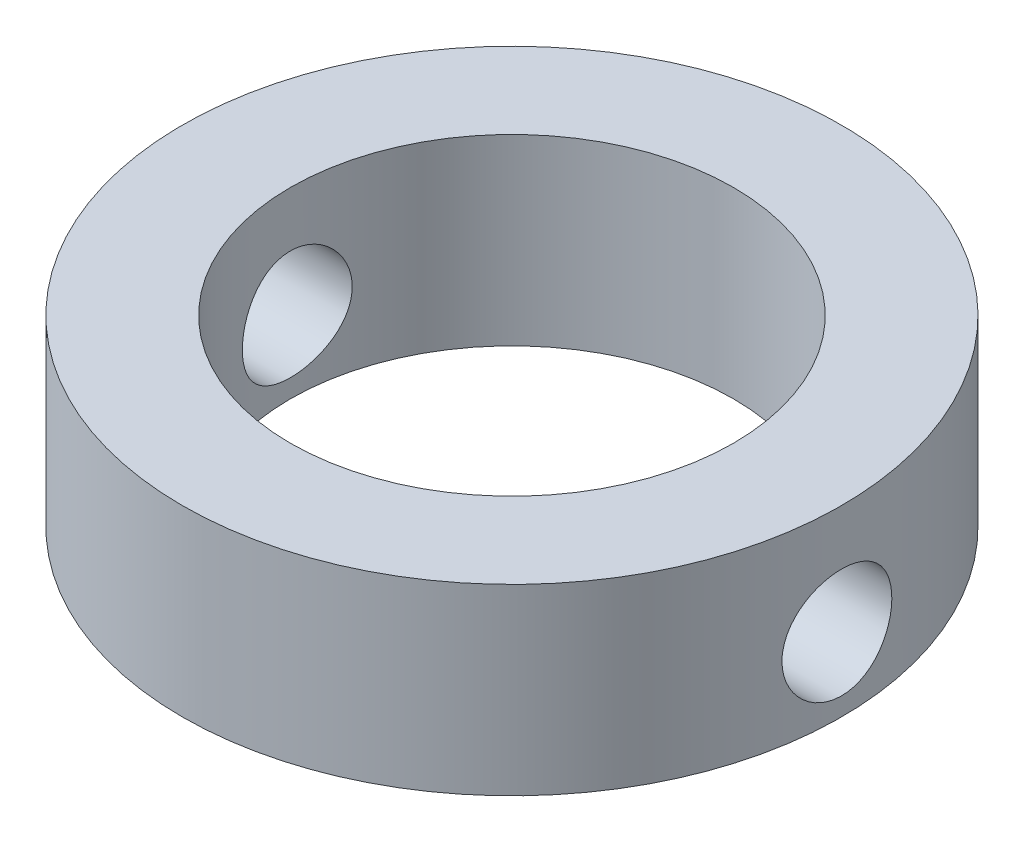
ISO-10303-21;
HEADER;
FILE_DESCRIPTION(('STEP AP214'),'2;1');
FILE_NAME('part.step','',(''),(''),'','','');
FILE_SCHEMA(('AUTOMOTIVE_DESIGN { 1 0 10303 214 1 1 1 1 }'));
ENDSEC;
DATA;
#1=APPLICATION_CONTEXT('core data for automotive mechanical design processes');
#2=APPLICATION_PROTOCOL_DEFINITION('international standard','automotive_design',2000,#1);
#3=PRODUCT_CONTEXT('',#1,'mechanical');
#4=PRODUCT('Part','Part','',(#3));
#5=PRODUCT_RELATED_PRODUCT_CATEGORY('part','',(#4));
#6=PRODUCT_DEFINITION_FORMATION('','',#4);
#7=PRODUCT_DEFINITION_CONTEXT('part definition',#1,'design');
#8=PRODUCT_DEFINITION('design','',#6,#7);
#9=PRODUCT_DEFINITION_SHAPE('','',#8);
#10=(LENGTH_UNIT() NAMED_UNIT(*) SI_UNIT(.MILLI.,.METRE.));
#11=(NAMED_UNIT(*) PLANE_ANGLE_UNIT() SI_UNIT($,.RADIAN.));
#12=(NAMED_UNIT(*) SI_UNIT($,.STERADIAN.) SOLID_ANGLE_UNIT());
#13=UNCERTAINTY_MEASURE_WITH_UNIT(LENGTH_MEASURE(1.E-05),#10,'distance_accuracy_value','');
#14=(GEOMETRIC_REPRESENTATION_CONTEXT(3) GLOBAL_UNCERTAINTY_ASSIGNED_CONTEXT((#13)) GLOBAL_UNIT_ASSIGNED_CONTEXT((#10,
#11,#12)) REPRESENTATION_CONTEXT('',''));
#15=CARTESIAN_POINT('',(0.,0.,0.));
#16=DIRECTION('',(0.,0.,1.));
#17=DIRECTION('',(1.,0.,0.));
#18=AXIS2_PLACEMENT_3D('',#15,#16,#17);
#19=CARTESIAN_POINT('',(-19.0091828831705,-210.,-53.2448828787845));
#20=DIRECTION('',(0.,-1.,0.));
#21=DIRECTION('',(0.,0.,-1.));
#22=AXIS2_PLACEMENT_3D('',#19,#20,#21);
#23=CYLINDRICAL_SURFACE('',#22,9.);
#24=CARTESIAN_POINT('',(-19.0091828831705,-210.,-53.2448828787845));
#25=DIRECTION('',(0.,1.,0.));
#26=DIRECTION('',(0.,0.,1.));
#27=AXIS2_PLACEMENT_3D('',#24,#25,#26);
#28=CIRCLE('',#27,9.);
#29=CARTESIAN_POINT('',(-19.0091828831705,-210.,-44.2448828787845));
#30=VERTEX_POINT('',#29);
#31=EDGE_CURVE('E10',#30,#30,#28,.T.);
#32=ORIENTED_EDGE('',*,*,#31,.F.);
#33=EDGE_LOOP('',(#32));
#34=FACE_BOUND('',#33,.T.);
#35=CARTESIAN_POINT('',(-19.0091828831705,-215.,-53.2448828787845));
#36=DIRECTION('',(0.,1.,0.));
#37=DIRECTION('',(0.,0.,1.));
#38=AXIS2_PLACEMENT_3D('',#35,#36,#37);
#39=CIRCLE('',#38,9.);
#40=CARTESIAN_POINT('',(-19.0091828831705,-215.,-44.2448828787845));
#41=VERTEX_POINT('',#40);
#42=EDGE_CURVE('E55',#41,#41,#39,.T.);
#43=ORIENTED_EDGE('',*,*,#42,.T.);
#44=EDGE_LOOP('',(#43));
#45=FACE_BOUND('',#44,.T.);
#46=CARTESIAN_POINT('',(-27.88330255782,-213.,-51.7448828787845));
#47=CARTESIAN_POINT('',(-27.8833040675782,-212.916374551112,-51.7448862397319));
#48=CARTESIAN_POINT('',(-27.8844974384589,-212.832703436385,-51.7518997773621));
#49=CARTESIAN_POINT('',(-27.8891376273796,-212.667708874068,-51.7797564219392));
#50=CARTESIAN_POINT('',(-27.8925865235191,-212.58638766375,-51.8006122825987));
#51=CARTESIAN_POINT('',(-27.9013365391045,-212.428504629986,-51.8555051525842));
#52=CARTESIAN_POINT('',(-27.9066361102022,-212.3519388908,-51.8895311458258));
#53=CARTESIAN_POINT('',(-27.9184885158566,-212.205611427172,-51.9697709806502));
#54=CARTESIAN_POINT('',(-27.9250412093554,-212.135848938254,-52.0159834506835));
#55=CARTESIAN_POINT('',(-27.9387337100862,-212.004412290153,-52.1197703626047));
#56=CARTESIAN_POINT('',(-27.9458781871329,-211.942814921168,-52.1774414494251));
#57=CARTESIAN_POINT('',(-27.9599077671873,-211.830124015883,-52.3022996759673));
#58=CARTESIAN_POINT('',(-27.9667928548024,-211.779031102131,-52.3694873792945));
#59=CARTESIAN_POINT('',(-27.9795773050654,-211.688511259668,-52.5119691568155));
#60=CARTESIAN_POINT('',(-27.9854705377642,-211.649155795361,-52.5873092299105));
#61=CARTESIAN_POINT('',(-27.9955553049135,-211.583687357682,-52.7436455057502));
#62=CARTESIAN_POINT('',(-27.9997469500066,-211.557573523269,-52.8246413403376));
#63=CARTESIAN_POINT('',(-28.0059232915168,-211.51956447901,-52.9891966429779));
#64=CARTESIAN_POINT('',(-28.007928001836,-211.507540250397,-53.0727255467769));
#65=CARTESIAN_POINT('',(-28.0095733592272,-211.497650547508,-53.240637707469));
#66=CARTESIAN_POINT('',(-28.0092141669864,-211.499784110852,-53.3250209059018));
#67=CARTESIAN_POINT('',(-28.0061880337589,-211.518048810917,-53.4913641898318));
#68=CARTESIAN_POINT('',(-28.0035439853249,-211.534041098045,-53.5733399972046));
#69=CARTESIAN_POINT('',(-27.9962707558004,-211.579350644548,-53.7334280665515));
#70=CARTESIAN_POINT('',(-27.9916415142498,-211.608668309754,-53.8115402107754));
#71=CARTESIAN_POINT('',(-27.9808790742423,-211.679934384189,-53.962096567454));
#72=CARTESIAN_POINT('',(-27.9747390871318,-211.721940007249,-54.0345131925959));
#73=CARTESIAN_POINT('',(-27.9616373115995,-211.817347693581,-54.1713221966924));
#74=CARTESIAN_POINT('',(-27.9546754566853,-211.870750679226,-54.235713925534));
#75=CARTESIAN_POINT('',(-27.9406044925661,-211.988207283972,-54.3554656428525));
#76=CARTESIAN_POINT('',(-27.9334946215568,-212.052382256941,-54.4107065801364));
#77=CARTESIAN_POINT('',(-27.9200106418794,-212.189152254129,-54.5096556318533));
#78=CARTESIAN_POINT('',(-27.9136365399985,-212.26174735601,-54.5533636399039));
#79=CARTESIAN_POINT('',(-27.9023454105414,-212.413434985126,-54.6280295394775));
#80=CARTESIAN_POINT('',(-27.8974300229861,-212.492534698855,-54.658973095152));
#81=CARTESIAN_POINT('',(-27.8896400153098,-212.654909443385,-54.7071008012738));
#82=CARTESIAN_POINT('',(-27.8867652155005,-212.738184105859,-54.7242861632452));
#83=CARTESIAN_POINT('',(-27.8834166397032,-212.905479693697,-54.744242009712));
#84=CARTESIAN_POINT('',(-27.8829145977225,-212.989479827821,-54.7471822035319));
#85=CARTESIAN_POINT('',(-27.8842930918647,-213.156772003015,-54.739016500394));
#86=CARTESIAN_POINT('',(-27.8861735359617,-213.240064071308,-54.7279111459593));
#87=CARTESIAN_POINT('',(-27.8920790079006,-213.403036655514,-54.6921142797413));
#88=CARTESIAN_POINT('',(-27.8960903946806,-213.482736683927,-54.6675091531723));
#89=CARTESIAN_POINT('',(-27.9057943212035,-213.636882099768,-54.6055017928998));
#90=CARTESIAN_POINT('',(-27.911486961514,-213.711327172531,-54.568098793645));
#91=CARTESIAN_POINT('',(-27.9239776535549,-213.853604756644,-54.481156882722));
#92=CARTESIAN_POINT('',(-27.9307854167726,-213.921369943654,-54.4315092172801));
#93=CARTESIAN_POINT('',(-27.9447108832497,-214.047668119617,-54.3216365582093));
#94=CARTESIAN_POINT('',(-27.9518286082825,-214.106200458666,-54.2614108206149));
#95=CARTESIAN_POINT('',(-27.9656614158801,-214.212991135637,-54.1313397209818));
#96=CARTESIAN_POINT('',(-27.9723715412386,-214.261136295771,-54.0614008308162));
#97=CARTESIAN_POINT('',(-27.9845535577682,-214.344993196203,-53.9143289475541));
#98=CARTESIAN_POINT('',(-27.9900254889904,-214.380705338684,-53.8371961872669));
#99=CARTESIAN_POINT('',(-27.999093032188,-214.438506350373,-53.6782623096853));
#100=CARTESIAN_POINT('',(-28.0026967905763,-214.460654445441,-53.5964832163461));
#101=CARTESIAN_POINT('',(-28.0076563821862,-214.490889359378,-53.430301319709));
#102=CARTESIAN_POINT('',(-28.0090124003716,-214.498977335239,-53.3458987328775));
#103=CARTESIAN_POINT('',(-28.0093211104975,-214.500829129387,-53.1779581133203));
#104=CARTESIAN_POINT('',(-28.008302695316,-214.494765152365,-53.0944219824229));
#105=CARTESIAN_POINT('',(-28.0040359534942,-214.468857646638,-52.9295756941957));
#106=CARTESIAN_POINT('',(-28.0007876393405,-214.449014195094,-52.848265524404));
#107=CARTESIAN_POINT('',(-27.992424816136,-214.396177100674,-52.6902450112333));
#108=CARTESIAN_POINT('',(-27.9873123854199,-214.363198099074,-52.6135296554921));
#109=CARTESIAN_POINT('',(-27.9757794244346,-214.285045238262,-52.4666946069953));
#110=CARTESIAN_POINT('',(-27.9693588321598,-214.239870800963,-52.396575227114));
#111=CARTESIAN_POINT('',(-27.9558286608844,-214.137998944523,-52.2640551114682));
#112=CARTESIAN_POINT('',(-27.9487120304749,-214.081175427146,-52.2017520204211));
#113=CARTESIAN_POINT('',(-27.934640702999,-213.957883015261,-52.0875045532157));
#114=CARTESIAN_POINT('',(-27.9276860442522,-213.891411864665,-52.0355626067638));
#115=CARTESIAN_POINT('',(-27.9146729445911,-213.750152806495,-51.9431743162327));
#116=CARTESIAN_POINT('',(-27.9086211910579,-213.675309396097,-51.9028118853277));
#117=CARTESIAN_POINT('',(-27.8981781445011,-213.519834458453,-51.8352941569199));
#118=CARTESIAN_POINT('',(-27.8937851936782,-213.439208806382,-51.8081256656455));
#119=CARTESIAN_POINT('',(-27.8881313521972,-213.298557738314,-51.7736672469112));
#120=CARTESIAN_POINT('',(-27.8863306236966,-213.239383915225,-51.7628904281823));
#121=CARTESIAN_POINT('',(-27.8839156948897,-213.120147909095,-51.748497101675));
#122=CARTESIAN_POINT('',(-27.8833014730432,-213.060085742202,-51.7448804639093));
#123=CARTESIAN_POINT('',(-27.88330255782,-213.,-51.7448828787845));
#124=B_SPLINE_CURVE_WITH_KNOTS('',3,(#46,#47,#48,#49,#50,#51,#52,#53,#54,#55,#56,#57,#58,#59,
#60,#61,#62,#63,#64,#65,#66,#67,#68,#69,#70,#71,#72,#73,#74,#75,#76,#77,#78,#79,#80,#81,#82,#83,
#84,#85,#86,#87,#88,#89,#90,#91,#92,#93,#94,#95,#96,#97,#98,#99,#100,#101,#102,#103,#104,#105,
#106,#107,#108,#109,#110,#111,#112,#113,#114,#115,#116,#117,#118,#119,#120,#121,#122,#123),
.UNSPECIFIED.,.T.,.F.,(4,2,2,2,2,2,2,2,2,2,2,2,2,2,2,2,2,2,2,2,2,2,2,2,2,2,2,2,2,2,2,2,2,2,2,2,
2,2,4),(0.,0.250656623343164,0.501544511951658,0.752222998698981,1.00287328440552,
1.25573495490816,1.50861160698055,1.76299788064249,2.01736761064056,2.26938940480927,
2.52139406789003,2.7709027269619,3.02041898547107,3.2710776248104,3.52175655733445,
3.77547674074661,4.02919926445001,4.28320597496551,4.53719031560234,4.78814125449636,
5.03908250045774,5.28843638778683,5.53780519373534,5.78947405655008,6.04116062655803,
6.29546467818616,6.54976050283404,6.80293790647973,7.05609447544798,7.30618665756937,
7.55627743928683,7.80609023896861,8.05591488232788,8.30860198475339,8.56134827326476,
8.81588236567713,9.07016140042578,9.25026402322166,9.43036337636995),.UNSPECIFIED.);
#125=CARTESIAN_POINT('',(-27.88330255782,-213.,-51.7448828787845));
#126=VERTEX_POINT('',#125);
#127=EDGE_CURVE('E85',#126,#126,#124,.T.);
#128=ORIENTED_EDGE('',*,*,#127,.F.);
#129=EDGE_LOOP('',(#128));
#130=FACE_BOUND('',#129,.T.);
#131=CARTESIAN_POINT('',(-10.1350632085211,-213.,-51.7448828787845));
#132=CARTESIAN_POINT('',(-10.1350616987629,-213.083625448888,-51.7448862397319));
#133=CARTESIAN_POINT('',(-10.1338683278821,-213.167296563615,-51.7518997773621));
#134=CARTESIAN_POINT('',(-10.1292281389615,-213.332291125932,-51.7797564219392));
#135=CARTESIAN_POINT('',(-10.125779242822,-213.41361233625,-51.8006122825987));
#136=CARTESIAN_POINT('',(-10.1170292272366,-213.571495370014,-51.8555051525842));
#137=CARTESIAN_POINT('',(-10.1117296561388,-213.6480611092,-51.8895311458258));
#138=CARTESIAN_POINT('',(-10.0998772504845,-213.794388572828,-51.9697709806502));
#139=CARTESIAN_POINT('',(-10.0933245569857,-213.864151061746,-52.0159834506835));
#140=CARTESIAN_POINT('',(-10.0796320562549,-213.995587709847,-52.1197703626047));
#141=CARTESIAN_POINT('',(-10.0724875792081,-214.057185078832,-52.1774414494251));
#142=CARTESIAN_POINT('',(-10.0584579991538,-214.169875984117,-52.3022996759673));
#143=CARTESIAN_POINT('',(-10.0515729115387,-214.220968897869,-52.3694873792945));
#144=CARTESIAN_POINT('',(-10.0387884612757,-214.311488740332,-52.5119691568155));
#145=CARTESIAN_POINT('',(-10.0328952285769,-214.350844204639,-52.5873092299105));
#146=CARTESIAN_POINT('',(-10.0228104614276,-214.416312642318,-52.7436455057502));
#147=CARTESIAN_POINT('',(-10.0186188163345,-214.442426476731,-52.8246413403376));
#148=CARTESIAN_POINT('',(-10.0124424748243,-214.48043552099,-52.9891966429779));
#149=CARTESIAN_POINT('',(-10.0104377645051,-214.492459749603,-53.0727255467769));
#150=CARTESIAN_POINT('',(-10.0087924071138,-214.502349452492,-53.240637707469));
#151=CARTESIAN_POINT('',(-10.0091515993547,-214.500215889148,-53.3250209059018));
#152=CARTESIAN_POINT('',(-10.0121777325822,-214.481951189083,-53.4913641898318));
#153=CARTESIAN_POINT('',(-10.0148217810161,-214.465958901955,-53.5733399972046));
#154=CARTESIAN_POINT('',(-10.0220950105407,-214.420649355452,-53.7334280665515));
#155=CARTESIAN_POINT('',(-10.0267242520913,-214.391331690246,-53.8115402107754));
#156=CARTESIAN_POINT('',(-10.0374866920988,-214.320065615811,-53.962096567454));
#157=CARTESIAN_POINT('',(-10.0436266792093,-214.278059992751,-54.0345131925959));
#158=CARTESIAN_POINT('',(-10.0567284547415,-214.182652306419,-54.1713221966924));
#159=CARTESIAN_POINT('',(-10.0636903096557,-214.129249320774,-54.235713925534));
#160=CARTESIAN_POINT('',(-10.077761273775,-214.011792716028,-54.3554656428525));
#161=CARTESIAN_POINT('',(-10.0848711447843,-213.947617743059,-54.4107065801364));
#162=CARTESIAN_POINT('',(-10.0983551244617,-213.81084774587,-54.5096556318533));
#163=CARTESIAN_POINT('',(-10.1047292263426,-213.73825264399,-54.5533636399039));
#164=CARTESIAN_POINT('',(-10.1160203557996,-213.586565014873,-54.6280295394775));
#165=CARTESIAN_POINT('',(-10.1209357433549,-213.507465301145,-54.658973095152));
#166=CARTESIAN_POINT('',(-10.1287257510313,-213.345090556615,-54.7071008012738));
#167=CARTESIAN_POINT('',(-10.1316005508406,-213.261815894141,-54.7242861632452));
#168=CARTESIAN_POINT('',(-10.1349491266378,-213.094520306303,-54.744242009712));
#169=CARTESIAN_POINT('',(-10.1354511686185,-213.010520172179,-54.7471822035319));
#170=CARTESIAN_POINT('',(-10.1340726744764,-212.843227996986,-54.739016500394));
#171=CARTESIAN_POINT('',(-10.1321922303794,-212.759935928692,-54.7279111459593));
#172=CARTESIAN_POINT('',(-10.1262867584404,-212.596963344485,-54.6921142797413));
#173=CARTESIAN_POINT('',(-10.1222753716604,-212.517263316073,-54.6675091531723));
#174=CARTESIAN_POINT('',(-10.1125714451375,-212.363117900232,-54.6055017928998));
#175=CARTESIAN_POINT('',(-10.1068788048271,-212.288672827469,-54.568098793645));
#176=CARTESIAN_POINT('',(-10.0943881127862,-212.146395243356,-54.481156882722));
#177=CARTESIAN_POINT('',(-10.0875803495684,-212.078630056346,-54.4315092172801));
#178=CARTESIAN_POINT('',(-10.0736548830913,-211.952331880383,-54.3216365582093));
#179=CARTESIAN_POINT('',(-10.0665371580585,-211.893799541334,-54.2614108206149));
#180=CARTESIAN_POINT('',(-10.0527043504609,-211.787008864363,-54.1313397209818));
#181=CARTESIAN_POINT('',(-10.0459942251025,-211.738863704229,-54.0614008308162));
#182=CARTESIAN_POINT('',(-10.0338122085729,-211.655006803797,-53.9143289475541));
#183=CARTESIAN_POINT('',(-10.0283402773507,-211.619294661316,-53.8371961872668));
#184=CARTESIAN_POINT('',(-10.019272734153,-211.561493649627,-53.6782623096853));
#185=CARTESIAN_POINT('',(-10.0156689757648,-211.539345554559,-53.596483216346));
#186=CARTESIAN_POINT('',(-10.0107093841548,-211.509110640622,-53.430301319709));
#187=CARTESIAN_POINT('',(-10.0093533659695,-211.501022664761,-53.3458987328775));
#188=CARTESIAN_POINT('',(-10.0090446558436,-211.499170870613,-53.1779581133203));
#189=CARTESIAN_POINT('',(-10.0100630710251,-211.505234847635,-53.0944219824229));
#190=CARTESIAN_POINT('',(-10.0143298128468,-211.531142353362,-52.9295756941957));
#191=CARTESIAN_POINT('',(-10.0175781270005,-211.550985804906,-52.848265524404));
#192=CARTESIAN_POINT('',(-10.025940950205,-211.603822899326,-52.6902450112333));
#193=CARTESIAN_POINT('',(-10.0310533809212,-211.636801900926,-52.6135296554921));
#194=CARTESIAN_POINT('',(-10.0425863419064,-211.714954761738,-52.4666946069953));
#195=CARTESIAN_POINT('',(-10.0490069341812,-211.760129199037,-52.396575227114));
#196=CARTESIAN_POINT('',(-10.0625371054567,-211.862001055477,-52.2640551114682));
#197=CARTESIAN_POINT('',(-10.0696537358661,-211.918824572854,-52.2017520204211));
#198=CARTESIAN_POINT('',(-10.083725063342,-212.042116984739,-52.0875045532157));
#199=CARTESIAN_POINT('',(-10.0906797220889,-212.108588135335,-52.0355626067638));
#200=CARTESIAN_POINT('',(-10.1036928217499,-212.249847193505,-51.9431743162327));
#201=CARTESIAN_POINT('',(-10.1097445752831,-212.324690603903,-51.9028118853277));
#202=CARTESIAN_POINT('',(-10.1201876218399,-212.480165541547,-51.8352941569199));
#203=CARTESIAN_POINT('',(-10.1245805726629,-212.560791193618,-51.8081256656455));
#204=CARTESIAN_POINT('',(-10.1302344141439,-212.701442261686,-51.7736672469112));
#205=CARTESIAN_POINT('',(-10.1320351426444,-212.760616084775,-51.7628904281823));
#206=CARTESIAN_POINT('',(-10.1344500714514,-212.879852090905,-51.748497101675));
#207=CARTESIAN_POINT('',(-10.1350642932979,-212.939914257798,-51.7448804639093));
#208=CARTESIAN_POINT('',(-10.1350632085211,-213.,-51.7448828787845));
#209=B_SPLINE_CURVE_WITH_KNOTS('',3,(#131,#132,#133,#134,#135,#136,#137,#138,#139,#140,#141,
#142,#143,#144,#145,#146,#147,#148,#149,#150,#151,#152,#153,#154,#155,#156,#157,#158,#159,#160,
#161,#162,#163,#164,#165,#166,#167,#168,#169,#170,#171,#172,#173,#174,#175,#176,#177,#178,#179,
#180,#181,#182,#183,#184,#185,#186,#187,#188,#189,#190,#191,#192,#193,#194,#195,#196,#197,#198,
#199,#200,#201,#202,#203,#204,#205,#206,#207,#208),.UNSPECIFIED.,.T.,.F.,(4,2,2,2,2,2,2,2,2,2,2,
2,2,2,2,2,2,2,2,2,2,2,2,2,2,2,2,2,2,2,2,2,2,2,2,2,2,2,4),(0.,0.250656623343164,
0.501544511951658,0.752222998698981,1.00287328440552,1.25573495490816,1.50861160698055,
1.76299788064249,2.01736761064056,2.26938940480927,2.52139406789003,2.77090272696189,
3.02041898547107,3.2710776248104,3.52175655733445,3.77547674074661,4.02919926445001,
4.28320597496551,4.53719031560234,4.78814125449633,5.03908250045774,5.28843638778683,
5.53780519373534,5.78947405655009,6.04116062655803,6.29546467818618,6.54976050283409,
6.80293790647977,7.05609447544798,7.30618665756938,7.55627743928682,7.80609023896861,
8.05591488232788,8.30860198475339,8.56134827326476,8.81588236567716,9.07016140042578,
9.25026402322163,9.43036337636995),.UNSPECIFIED.);
#210=CARTESIAN_POINT('',(-10.1350632085211,-213.,-51.7448828787845));
#211=VERTEX_POINT('',#210);
#212=EDGE_CURVE('E63',#211,#211,#209,.T.);
#213=ORIENTED_EDGE('',*,*,#212,.F.);
#214=EDGE_LOOP('',(#213));
#215=FACE_BOUND('',#214,.T.);
#216=ADVANCED_FACE('F39',(#34,#45,#130,#215),#23,.T.);
#217=CARTESIAN_POINT('',(-19.0091828831705,-209.9,-53.2448828787845));
#218=DIRECTION('',(0.,-1.,0.));
#219=DIRECTION('',(0.,0.,-1.));
#220=AXIS2_PLACEMENT_3D('',#217,#218,#219);
#221=CYLINDRICAL_SURFACE('',#220,6.05);
#222=CARTESIAN_POINT('',(-24.8702834624133,-213.,-51.7448828787845));
#223=CARTESIAN_POINT('',(-24.8702850568459,-212.917145871372,-51.7448852714866));
#224=CARTESIAN_POINT('',(-24.8720595174571,-212.83426511614,-51.7517710666074));
#225=CARTESIAN_POINT('',(-24.8789478656689,-212.670882052661,-51.7790893724568));
#226=CARTESIAN_POINT('',(-24.8840637292599,-212.590381181258,-51.7995298990955));
#227=CARTESIAN_POINT('',(-24.8970206697318,-212.434144766549,-51.8532567636231));
#228=CARTESIAN_POINT('',(-24.9048582645577,-212.358403279826,-51.886526694153));
#229=CARTESIAN_POINT('',(-24.9223712447743,-212.213569094319,-51.9649181769439));
#230=CARTESIAN_POINT('',(-24.9320467002792,-212.144476649346,-52.0100401813859));
#231=CARTESIAN_POINT('',(-24.9523796561404,-212.013406159432,-52.1118981320343));
#232=CARTESIAN_POINT('',(-24.9630526354277,-211.951593249911,-52.168843525269));
#233=CARTESIAN_POINT('',(-24.9840437016995,-211.838290682976,-52.2922805759095));
#234=CARTESIAN_POINT('',(-24.9943617558478,-211.786801978596,-52.3587731136471));
#235=CARTESIAN_POINT('',(-25.0136514801466,-211.694935328621,-52.500546607136));
#236=CARTESIAN_POINT('',(-25.0226027540224,-211.654719373618,-52.5759355450226));
#237=CARTESIAN_POINT('',(-25.0379738821197,-211.587592712703,-52.7326624126282));
#238=CARTESIAN_POINT('',(-25.0443941034728,-211.560680076987,-52.8139994775348));
#239=CARTESIAN_POINT('',(-25.0538703190283,-211.521452276688,-52.978592482665));
#240=CARTESIAN_POINT('',(-25.0569908413507,-211.508856747212,-53.0617778237047));
#241=CARTESIAN_POINT('',(-25.0597408348001,-211.497740893098,-53.2291354417412));
#242=CARTESIAN_POINT('',(-25.0593708139073,-211.499218520387,-53.3133075733494));
#243=CARTESIAN_POINT('',(-25.0552295363811,-211.516004889703,-53.478305767371));
#244=CARTESIAN_POINT('',(-25.0515326948305,-211.531011035916,-53.5591647633216));
#245=CARTESIAN_POINT('',(-25.0412396704779,-211.573942381363,-53.7171792065156));
#246=CARTESIAN_POINT('',(-25.0346433347749,-211.601868261907,-53.7943344582088));
#247=CARTESIAN_POINT('',(-25.0191782452565,-211.670092763352,-53.9435514464938));
#248=CARTESIAN_POINT('',(-25.0102897408778,-211.710499557116,-54.015561593629));
#249=CARTESIAN_POINT('',(-24.9912052260717,-211.802456929857,-54.1518854701365));
#250=CARTESIAN_POINT('',(-24.9810089916444,-211.854009419009,-54.2161978773138));
#251=CARTESIAN_POINT('',(-24.9601004734071,-211.968418739372,-54.3371050379952));
#252=CARTESIAN_POINT('',(-24.9493816778842,-212.031540031227,-54.3934486825601));
#253=CARTESIAN_POINT('',(-24.9288849641037,-212.166447544473,-54.4948064376446));
#254=CARTESIAN_POINT('',(-24.9191070883614,-212.238234157074,-54.5398200363668));
#255=CARTESIAN_POINT('',(-24.9015763700652,-212.388921008808,-54.6173971643501));
#256=CARTESIAN_POINT('',(-24.8938332649706,-212.467853107807,-54.6499011607648));
#257=CARTESIAN_POINT('',(-24.8813742843728,-212.630299513716,-54.7011005722889));
#258=CARTESIAN_POINT('',(-24.8766577731665,-212.713812854385,-54.7197988872556));
#259=CARTESIAN_POINT('',(-24.8709191734455,-212.88072474514,-54.7424414489509));
#260=CARTESIAN_POINT('',(-24.8698042388138,-212.964069849902,-54.7467565794362));
#261=CARTESIAN_POINT('',(-24.8711424584858,-213.130289310283,-54.7415248691219));
#262=CARTESIAN_POINT('',(-24.8735952903387,-213.213163707763,-54.7319792810398));
#263=CARTESIAN_POINT('',(-24.8817037901151,-213.374718130252,-54.6996220670496));
#264=CARTESIAN_POINT('',(-24.8873074853785,-213.453444096,-54.6770255523593));
#265=CARTESIAN_POINT('',(-24.9010371444395,-213.605990866611,-54.6194460252897));
#266=CARTESIAN_POINT('',(-24.9091634032059,-213.679811096609,-54.5844615642934));
#267=CARTESIAN_POINT('',(-24.9272186395328,-213.822024713169,-54.5023201124649));
#268=CARTESIAN_POINT('',(-24.9371794257557,-213.89028562448,-54.4549409096159));
#269=CARTESIAN_POINT('',(-24.9577029518504,-214.018024313333,-54.3496365426515));
#270=CARTESIAN_POINT('',(-24.9682657887546,-214.077500669491,-54.2917096752495));
#271=CARTESIAN_POINT('',(-24.989117316607,-214.187479914155,-54.1652538364561));
#272=CARTESIAN_POINT('',(-24.9993928998793,-214.237726490308,-54.0964993870566));
#273=CARTESIAN_POINT('',(-25.0182432675438,-214.325960338467,-53.9513131747291));
#274=CARTESIAN_POINT('',(-25.0268181402405,-214.363948247033,-53.8748818107134));
#275=CARTESIAN_POINT('',(-25.0412471368977,-214.426259322716,-53.7170373492165));
#276=CARTESIAN_POINT('',(-25.0471206544415,-214.450680162875,-53.6356646657471));
#277=CARTESIAN_POINT('',(-25.055569989341,-214.485458073156,-53.469805777597));
#278=CARTESIAN_POINT('',(-25.0581464319434,-214.495817809803,-53.385320166369));
#279=CARTESIAN_POINT('',(-25.0596862845965,-214.502031514408,-53.2180432793975));
#280=CARTESIAN_POINT('',(-25.0587439852062,-214.498264033302,-53.1352667185128));
#281=CARTESIAN_POINT('',(-25.0535608306931,-214.477195886485,-52.9715652774665));
#282=CARTESIAN_POINT('',(-25.0493200707326,-214.459895611202,-52.890640343954));
#283=CARTESIAN_POINT('',(-25.0380305583394,-214.412454589756,-52.7333283883995));
#284=CARTESIAN_POINT('',(-25.0309965652214,-214.382381278526,-52.6569199016117));
#285=CARTESIAN_POINT('',(-25.0148619656469,-214.310309234355,-52.5101902687428));
#286=CARTESIAN_POINT('',(-25.0057611024955,-214.268309019989,-52.4398698802725));
#287=CARTESIAN_POINT('',(-24.9862062239836,-214.172415313698,-52.3055139125641));
#288=CARTESIAN_POINT('',(-24.9757253218841,-214.118264305729,-52.2416660406226));
#289=CARTESIAN_POINT('',(-24.9547141160229,-214.000107510859,-52.1238349388713));
#290=CARTESIAN_POINT('',(-24.9441838004572,-213.936099239464,-52.0698542035653));
#291=CARTESIAN_POINT('',(-24.9240473496045,-213.798637306859,-51.9723226509854));
#292=CARTESIAN_POINT('',(-24.9144616117148,-213.725032456485,-51.9289803847085));
#293=CARTESIAN_POINT('',(-24.8975727325172,-213.571354258327,-51.855349825805));
#294=CARTESIAN_POINT('',(-24.8902679119987,-213.491285724021,-51.8250519236661));
#295=CARTESIAN_POINT('',(-24.879924526445,-213.34278419005,-51.7829446986912));
#296=CARTESIAN_POINT('',(-24.876336100783,-213.275069134371,-51.768702355673));
#297=CARTESIAN_POINT('',(-24.8715150004875,-213.138242154339,-51.7496708363202));
#298=CARTESIAN_POINT('',(-24.8702821320792,-213.069130345359,-51.7448808824045));
#299=CARTESIAN_POINT('',(-24.8702834624133,-213.,-51.7448828787845));
#300=B_SPLINE_CURVE_WITH_KNOTS('',3,(#222,#223,#224,#225,#226,#227,#228,#229,#230,#231,#232,
#233,#234,#235,#236,#237,#238,#239,#240,#241,#242,#243,#244,#245,#246,#247,#248,#249,#250,#251,
#252,#253,#254,#255,#256,#257,#258,#259,#260,#261,#262,#263,#264,#265,#266,#267,#268,#269,#270,
#271,#272,#273,#274,#275,#276,#277,#278,#279,#280,#281,#282,#283,#284,#285,#286,#287,#288,#289,
#290,#291,#292,#293,#294,#295,#296,#297,#298,#299),.UNSPECIFIED.,.T.,.F.,(4,2,2,2,2,2,2,2,2,2,2,
2,2,2,2,2,2,2,2,2,2,2,2,2,2,2,2,2,2,2,2,2,2,2,2,2,2,2,4),(0.,0.248308555378162,
0.496764084985487,0.744902916216997,0.993051215830481,1.24604175182047,1.49905563079246,
1.75553800799939,2.01198316847503,2.26331496642089,2.51461018850564,2.76042038788379,
3.0062435512986,3.2542600780021,3.5023191440844,3.75698358308596,4.01165952364873,
4.26753289950168,4.52335251433646,4.77252234046924,5.0216696482933,5.2668230552269,
5.51200513928916,5.7619263419736,6.01188793896212,6.26798960627748,6.52407797276705,
6.77829797232379,7.0324697552718,7.27988006564555,7.5272832383672,7.77339617740614,
8.01953969916323,8.27149784954299,8.52351960945304,8.78014536003374,9.03658173491865,
9.24377802972129,9.45095727924299),.UNSPECIFIED.);
#301=CARTESIAN_POINT('',(-24.8702834624133,-213.,-51.7448828787845));
#302=VERTEX_POINT('',#301);
#303=EDGE_CURVE('E65',#302,#302,#300,.T.);
#304=ORIENTED_EDGE('',*,*,#303,.T.);
#305=EDGE_LOOP('',(#304));
#306=FACE_BOUND('',#305,.T.);
#307=CARTESIAN_POINT('',(-19.0091828831705,-210.,-53.2448828787845));
#308=DIRECTION('',(0.,1.,0.));
#309=DIRECTION('',(0.,0.,1.));
#310=AXIS2_PLACEMENT_3D('',#307,#308,#309);
#311=CIRCLE('',#310,6.05);
#312=CARTESIAN_POINT('',(-19.0091828831705,-210.,-47.1948828787845));
#313=VERTEX_POINT('',#312);
#314=EDGE_CURVE('E60',#313,#313,#311,.F.);
#315=ORIENTED_EDGE('',*,*,#314,.F.);
#316=EDGE_LOOP('',(#315));
#317=FACE_BOUND('',#316,.T.);
#318=CARTESIAN_POINT('',(-19.0091828831705,-215.,-53.2448828787845));
#319=DIRECTION('',(0.,1.,0.));
#320=DIRECTION('',(0.,0.,1.));
#321=AXIS2_PLACEMENT_3D('',#318,#319,#320);
#322=CIRCLE('',#321,6.05);
#323=CARTESIAN_POINT('',(-19.0091828831705,-215.,-47.1948828787845));
#324=VERTEX_POINT('',#323);
#325=EDGE_CURVE('E62',#324,#324,#322,.F.);
#326=ORIENTED_EDGE('',*,*,#325,.T.);
#327=EDGE_LOOP('',(#326));
#328=FACE_BOUND('',#327,.T.);
#329=CARTESIAN_POINT('',(-13.1480823039278,-213.,-51.7448828787845));
#330=CARTESIAN_POINT('',(-13.1480807094952,-213.082854128628,-51.7448852714866));
#331=CARTESIAN_POINT('',(-13.146306248884,-213.16573488386,-51.7517710666074));
#332=CARTESIAN_POINT('',(-13.1394179006722,-213.329117947339,-51.7790893724568));
#333=CARTESIAN_POINT('',(-13.1343020370812,-213.409618818742,-51.7995298990955));
#334=CARTESIAN_POINT('',(-13.1213450966092,-213.565855233451,-51.8532567636231));
#335=CARTESIAN_POINT('',(-13.1135075017833,-213.641596720174,-51.886526694153));
#336=CARTESIAN_POINT('',(-13.0959945215668,-213.786430905681,-51.9649181769439));
#337=CARTESIAN_POINT('',(-13.0863190660618,-213.855523350654,-52.0100401813859));
#338=CARTESIAN_POINT('',(-13.0659861102007,-213.986593840568,-52.1118981320343));
#339=CARTESIAN_POINT('',(-13.0553131309134,-214.048406750089,-52.168843525269));
#340=CARTESIAN_POINT('',(-13.0343220646416,-214.161709317024,-52.2922805759095));
#341=CARTESIAN_POINT('',(-13.0240040104932,-214.213198021404,-52.3587731136471));
#342=CARTESIAN_POINT('',(-13.0047142861945,-214.305064671379,-52.500546607136));
#343=CARTESIAN_POINT('',(-12.9957630123186,-214.345280626382,-52.5759355450226));
#344=CARTESIAN_POINT('',(-12.9803918842214,-214.412407287297,-52.7326624126282));
#345=CARTESIAN_POINT('',(-12.9739716628683,-214.439319923013,-52.8139994775348));
#346=CARTESIAN_POINT('',(-12.9644954473128,-214.478547723312,-52.978592482665));
#347=CARTESIAN_POINT('',(-12.9613749249903,-214.491143252788,-53.0617778237047));
#348=CARTESIAN_POINT('',(-12.9586249315409,-214.502259106902,-53.2291354417412));
#349=CARTESIAN_POINT('',(-12.9589949524337,-214.500781479613,-53.3133075733494));
#350=CARTESIAN_POINT('',(-12.96313622996,-214.483995110297,-53.478305767371));
#351=CARTESIAN_POINT('',(-12.9668330715105,-214.468988964084,-53.5591647633216));
#352=CARTESIAN_POINT('',(-12.9771260958631,-214.426057618637,-53.7171792065156));
#353=CARTESIAN_POINT('',(-12.9837224315662,-214.398131738093,-53.7943344582088));
#354=CARTESIAN_POINT('',(-12.9991875210846,-214.329907236648,-53.9435514464938));
#355=CARTESIAN_POINT('',(-13.0080760254632,-214.289500442884,-54.015561593629));
#356=CARTESIAN_POINT('',(-13.0271605402694,-214.197543070143,-54.1518854701365));
#357=CARTESIAN_POINT('',(-13.0373567746967,-214.145990580991,-54.2161978773138));
#358=CARTESIAN_POINT('',(-13.058265292934,-214.031581260628,-54.3371050379952));
#359=CARTESIAN_POINT('',(-13.0689840884569,-213.968459968773,-54.3934486825601));
#360=CARTESIAN_POINT('',(-13.0894808022373,-213.833552455527,-54.4948064376446));
#361=CARTESIAN_POINT('',(-13.0992586779796,-213.761765842926,-54.5398200363668));
#362=CARTESIAN_POINT('',(-13.1167893962759,-213.611078991192,-54.6173971643501));
#363=CARTESIAN_POINT('',(-13.1245325013705,-213.532146892193,-54.6499011607648));
#364=CARTESIAN_POINT('',(-13.1369914819683,-213.369700486284,-54.7011005722889));
#365=CARTESIAN_POINT('',(-13.1417079931746,-213.286187145615,-54.7197988872556));
#366=CARTESIAN_POINT('',(-13.1474465928955,-213.11927525486,-54.7424414489509));
#367=CARTESIAN_POINT('',(-13.1485615275273,-213.035930150098,-54.7467565794362));
#368=CARTESIAN_POINT('',(-13.1472233078552,-212.869710689717,-54.7415248691219));
#369=CARTESIAN_POINT('',(-13.1447704760023,-212.786836292237,-54.7319792810398));
#370=CARTESIAN_POINT('',(-13.136661976226,-212.625281869748,-54.6996220670496));
#371=CARTESIAN_POINT('',(-13.1310582809626,-212.546555904,-54.6770255523593));
#372=CARTESIAN_POINT('',(-13.1173286219016,-212.394009133389,-54.6194460252897));
#373=CARTESIAN_POINT('',(-13.1092023631352,-212.320188903391,-54.5844615642934));
#374=CARTESIAN_POINT('',(-13.0911471268082,-212.177975286831,-54.5023201124649));
#375=CARTESIAN_POINT('',(-13.0811863405854,-212.10971437552,-54.4549409096159));
#376=CARTESIAN_POINT('',(-13.0606628144907,-211.981975686667,-54.3496365426515));
#377=CARTESIAN_POINT('',(-13.0500999775865,-211.922499330509,-54.2917096752495));
#378=CARTESIAN_POINT('',(-13.0292484497341,-211.812520085845,-54.1652538364561));
#379=CARTESIAN_POINT('',(-13.0189728664618,-211.762273509692,-54.0964993870566));
#380=CARTESIAN_POINT('',(-13.0001224987973,-211.674039661533,-53.9513131747291));
#381=CARTESIAN_POINT('',(-12.9915476261006,-211.636051752967,-53.8748818107134));
#382=CARTESIAN_POINT('',(-12.9771186294434,-211.573740677284,-53.7170373492165));
#383=CARTESIAN_POINT('',(-12.9712451118996,-211.549319837125,-53.6356646657471));
#384=CARTESIAN_POINT('',(-12.9627957770001,-211.514541926844,-53.469805777597));
#385=CARTESIAN_POINT('',(-12.9602193343977,-211.504182190197,-53.385320166369));
#386=CARTESIAN_POINT('',(-12.9586794817446,-211.497968485592,-53.2180432793975));
#387=CARTESIAN_POINT('',(-12.9596217811348,-211.501735966698,-53.1352667185128));
#388=CARTESIAN_POINT('',(-12.9648049356479,-211.522804113515,-52.9715652774665));
#389=CARTESIAN_POINT('',(-12.9690456956084,-211.540104388798,-52.890640343954));
#390=CARTESIAN_POINT('',(-12.9803352080017,-211.587545410244,-52.7333283883994));
#391=CARTESIAN_POINT('',(-12.9873692011196,-211.617618721474,-52.6569199016116));
#392=CARTESIAN_POINT('',(-13.0035038006941,-211.689690765645,-52.5101902687428));
#393=CARTESIAN_POINT('',(-13.0126046638455,-211.731690980011,-52.4398698802725));
#394=CARTESIAN_POINT('',(-13.0321595423575,-211.827584686302,-52.305513912564));
#395=CARTESIAN_POINT('',(-13.0426404444569,-211.881735694271,-52.2416660406225));
#396=CARTESIAN_POINT('',(-13.0636516503181,-211.999892489141,-52.1238349388713));
#397=CARTESIAN_POINT('',(-13.0741819658838,-212.063900760536,-52.0698542035653));
#398=CARTESIAN_POINT('',(-13.0943184167365,-212.201362693141,-51.9723226509854));
#399=CARTESIAN_POINT('',(-13.1039041546263,-212.274967543515,-51.9289803847085));
#400=CARTESIAN_POINT('',(-13.1207930338238,-212.428645741673,-51.855349825805));
#401=CARTESIAN_POINT('',(-13.1280978543423,-212.508714275979,-51.8250519236661));
#402=CARTESIAN_POINT('',(-13.138441239896,-212.65721580995,-51.7829446986912));
#403=CARTESIAN_POINT('',(-13.142029665558,-212.724930865629,-51.768702355673));
#404=CARTESIAN_POINT('',(-13.1468507658536,-212.861757845661,-51.7496708363202));
#405=CARTESIAN_POINT('',(-13.1480836342619,-212.930869654641,-51.7448808824045));
#406=CARTESIAN_POINT('',(-13.1480823039278,-213.,-51.7448828787845));
#407=B_SPLINE_CURVE_WITH_KNOTS('',3,(#329,#330,#331,#332,#333,#334,#335,#336,#337,#338,#339,
#340,#341,#342,#343,#344,#345,#346,#347,#348,#349,#350,#351,#352,#353,#354,#355,#356,#357,#358,
#359,#360,#361,#362,#363,#364,#365,#366,#367,#368,#369,#370,#371,#372,#373,#374,#375,#376,#377,
#378,#379,#380,#381,#382,#383,#384,#385,#386,#387,#388,#389,#390,#391,#392,#393,#394,#395,#396,
#397,#398,#399,#400,#401,#402,#403,#404,#405,#406),.UNSPECIFIED.,.T.,.F.,(4,2,2,2,2,2,2,2,2,2,2,
2,2,2,2,2,2,2,2,2,2,2,2,2,2,2,2,2,2,2,2,2,2,2,2,2,2,2,4),(0.,0.248308555378162,
0.496764084985487,0.744902916216997,0.993051215830481,1.24604175182047,1.49905563079246,
1.75553800799939,2.01198316847503,2.26331496642089,2.51461018850564,2.76042038788379,
3.0062435512986,3.2542600780021,3.5023191440844,3.75698358308596,4.01165952364873,
4.26753289950165,4.52335251433646,4.77252234046924,5.0216696482933,5.2668230552269,
5.51200513928916,5.76192634197363,6.01188793896213,6.26798960627747,6.52407797276706,
6.77829797232379,7.0324697552718,7.27988006564556,7.52728323836721,7.77339617740616,
8.01953969916323,8.27149784954303,8.52351960945306,8.78014536003374,9.03658173491862,
9.24377802972127,9.45095727924299),.UNSPECIFIED.);
#408=CARTESIAN_POINT('',(-13.1480823039278,-213.,-51.7448828787845));
#409=VERTEX_POINT('',#408);
#410=EDGE_CURVE('E43',#409,#409,#407,.T.);
#411=ORIENTED_EDGE('',*,*,#410,.T.);
#412=EDGE_LOOP('',(#411));
#413=FACE_BOUND('',#412,.T.);
#414=ADVANCED_FACE('F66',(#306,#317,#328,#413),#221,.F.);
#415=CARTESIAN_POINT('',(-19.0091828831705,-210.,-53.2448828787845));
#416=DIRECTION('',(0.,1.,0.));
#417=DIRECTION('',(0.,0.,1.));
#418=AXIS2_PLACEMENT_3D('',#415,#416,#417);
#419=PLANE('',#418);
#420=ORIENTED_EDGE('',*,*,#314,.T.);
#421=EDGE_LOOP('',(#420));
#422=FACE_BOUND('',#421,.T.);
#423=ORIENTED_EDGE('',*,*,#31,.T.);
#424=EDGE_LOOP('',(#423));
#425=FACE_BOUND('',#424,.T.);
#426=ADVANCED_FACE('F99',(#422,#425),#419,.T.);
#427=CARTESIAN_POINT('',(-19.0091828831705,-215.,-53.2448828787845));
#428=DIRECTION('',(0.,1.,0.));
#429=DIRECTION('',(0.,0.,1.));
#430=AXIS2_PLACEMENT_3D('',#427,#428,#429);
#431=PLANE('',#430);
#432=ORIENTED_EDGE('',*,*,#325,.F.);
#433=EDGE_LOOP('',(#432));
#434=FACE_BOUND('',#433,.T.);
#435=ORIENTED_EDGE('',*,*,#42,.F.);
#436=EDGE_LOOP('',(#435));
#437=FACE_BOUND('',#436,.T.);
#438=ADVANCED_FACE('F107',(#434,#437),#431,.F.);
#439=CARTESIAN_POINT('',(-9.00918288317053,-213.,-53.2448828787845));
#440=DIRECTION('',(-1.,0.,0.));
#441=DIRECTION('',(0.,0.,1.));
#442=AXIS2_PLACEMENT_3D('',#439,#440,#441);
#443=CYLINDRICAL_SURFACE('',#442,1.5);
#444=ORIENTED_EDGE('',*,*,#303,.F.);
#445=EDGE_LOOP('',(#444));
#446=FACE_BOUND('',#445,.T.);
#447=ORIENTED_EDGE('',*,*,#127,.T.);
#448=EDGE_LOOP('',(#447));
#449=FACE_BOUND('',#448,.T.);
#450=ADVANCED_FACE('F76',(#446,#449),#443,.F.);
#451=ORIENTED_EDGE('',*,*,#410,.F.);
#452=EDGE_LOOP('',(#451));
#453=FACE_BOUND('',#452,.T.);
#454=ORIENTED_EDGE('',*,*,#212,.T.);
#455=EDGE_LOOP('',(#454));
#456=FACE_BOUND('',#455,.T.);
#457=ADVANCED_FACE('F71',(#453,#456),#443,.F.);
#458=CLOSED_SHELL('',(#216,#414,#426,#438,#450,#457));
#459=MANIFOLD_SOLID_BREP('B2',#458);
#460=ADVANCED_BREP_SHAPE_REPRESENTATION('',(#18,#459),#14);
#461=SHAPE_DEFINITION_REPRESENTATION(#9,#460);
ENDSEC;
END-ISO-10303-21;
